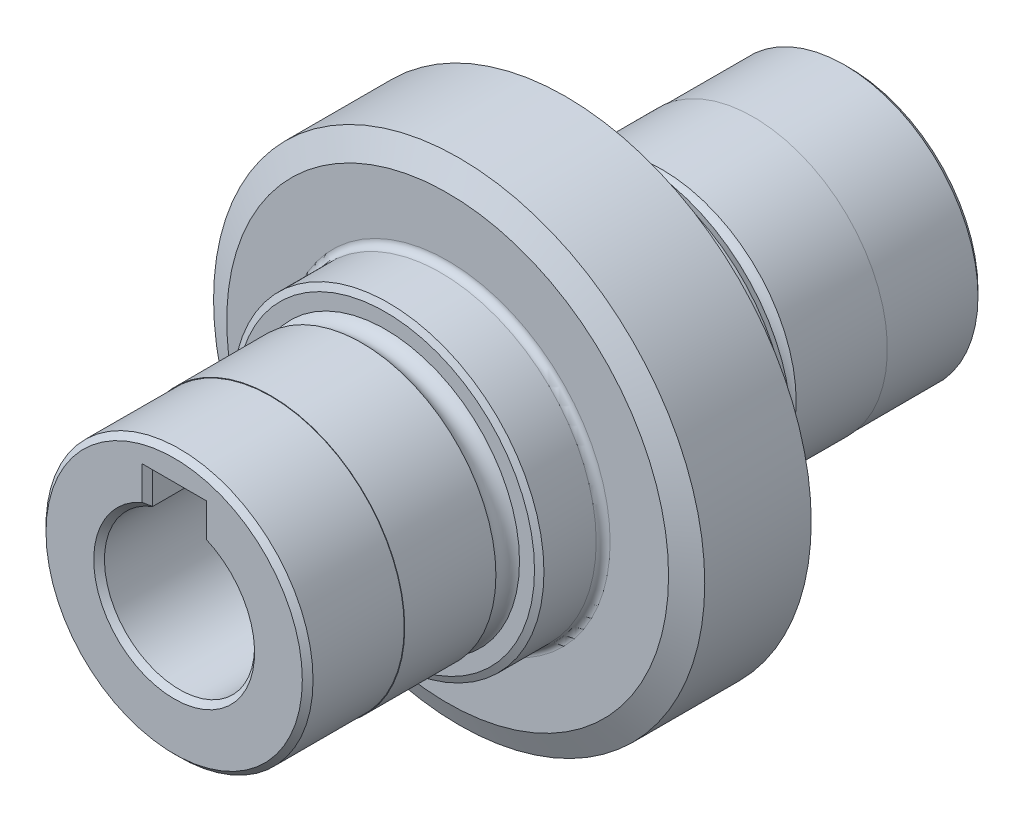
ISO-10303-21;
HEADER;
FILE_DESCRIPTION(('STEP AP214'),'2;1');
FILE_NAME('part.step','',(''),(''),'','','');
FILE_SCHEMA(('AUTOMOTIVE_DESIGN { 1 0 10303 214 1 1 1 1 }'));
ENDSEC;
DATA;
#1=APPLICATION_CONTEXT('core data for automotive mechanical design processes');
#2=APPLICATION_PROTOCOL_DEFINITION('international standard','automotive_design',2000,#1);
#3=PRODUCT_CONTEXT('',#1,'mechanical');
#4=PRODUCT('Part','Part','',(#3));
#5=PRODUCT_RELATED_PRODUCT_CATEGORY('part','',(#4));
#6=PRODUCT_DEFINITION_FORMATION('','',#4);
#7=PRODUCT_DEFINITION_CONTEXT('part definition',#1,'design');
#8=PRODUCT_DEFINITION('design','',#6,#7);
#9=PRODUCT_DEFINITION_SHAPE('','',#8);
#10=(LENGTH_UNIT() NAMED_UNIT(*) SI_UNIT(.MILLI.,.METRE.));
#11=(NAMED_UNIT(*) PLANE_ANGLE_UNIT() SI_UNIT($,.RADIAN.));
#12=(NAMED_UNIT(*) SI_UNIT($,.STERADIAN.) SOLID_ANGLE_UNIT());
#13=UNCERTAINTY_MEASURE_WITH_UNIT(LENGTH_MEASURE(1.E-05),#10,'distance_accuracy_value','');
#14=(GEOMETRIC_REPRESENTATION_CONTEXT(3) GLOBAL_UNCERTAINTY_ASSIGNED_CONTEXT((#13)) GLOBAL_UNIT_ASSIGNED_CONTEXT((#10,
#11,#12)) REPRESENTATION_CONTEXT('',''));
#15=CARTESIAN_POINT('',(0.,0.,0.));
#16=DIRECTION('',(0.,0.,1.));
#17=DIRECTION('',(1.,0.,0.));
#18=AXIS2_PLACEMENT_3D('',#15,#16,#17);
#19=CARTESIAN_POINT('',(0.,0.,31.5));
#20=DIRECTION('',(0.,0.,1.));
#21=DIRECTION('',(1.,0.,0.));
#22=AXIS2_PLACEMENT_3D('',#19,#20,#21);
#23=PLANE('',#22);
#24=CARTESIAN_POINT('',(0.,0.,31.5));
#25=DIRECTION('',(0.,0.,1.));
#26=DIRECTION('',(1.,0.,0.));
#27=AXIS2_PLACEMENT_3D('',#24,#25,#26);
#28=CIRCLE('',#27,11.95);
#29=CARTESIAN_POINT('',(11.95,0.,31.5));
#30=VERTEX_POINT('',#29);
#31=EDGE_CURVE('E130',#30,#30,#28,.T.);
#32=ORIENTED_EDGE('',*,*,#31,.T.);
#33=EDGE_LOOP('',(#32));
#34=FACE_BOUND('',#33,.T.);
#35=DIRECTION('',(0.,1.,0.));
#36=VECTOR('',#35,1.);
#37=CARTESIAN_POINT('',(-3.00000000000001,9.5,31.5));
#38=LINE('',#37,#36);
#39=CARTESIAN_POINT('',(-3.00000000000001,6.87386354243377,31.5));
#40=VERTEX_POINT('',#39);
#41=CARTESIAN_POINT('',(-3.00000000000001,10.,31.5));
#42=VERTEX_POINT('',#41);
#43=EDGE_CURVE('E129',#40,#42,#38,.T.);
#44=ORIENTED_EDGE('',*,*,#43,.T.);
#45=DIRECTION('',(1.,0.,0.));
#46=VECTOR('',#45,1.);
#47=CARTESIAN_POINT('',(2.5,10.,31.5));
#48=LINE('',#47,#46);
#49=CARTESIAN_POINT('',(3.00000000000002,10.,31.5));
#50=VERTEX_POINT('',#49);
#51=EDGE_CURVE('E109',#42,#50,#48,.T.);
#52=ORIENTED_EDGE('',*,*,#51,.T.);
#53=DIRECTION('',(0.,-1.,0.));
#54=VECTOR('',#53,1.);
#55=CARTESIAN_POINT('',(3.00000000000002,6.53834841531101,31.5));
#56=LINE('',#55,#54);
#57=CARTESIAN_POINT('',(3.00000000000002,6.87386354243377,31.5));
#58=VERTEX_POINT('',#57);
#59=EDGE_CURVE('E119',#50,#58,#56,.T.);
#60=ORIENTED_EDGE('',*,*,#59,.T.);
#61=CARTESIAN_POINT('',(0.,0.,31.5));
#62=DIRECTION('',(0.,0.,1.));
#63=DIRECTION('',(1.,0.,0.));
#64=AXIS2_PLACEMENT_3D('',#61,#62,#63);
#65=CIRCLE('',#64,7.50000000000001);
#66=EDGE_CURVE('E125',#58,#40,#65,.F.);
#67=ORIENTED_EDGE('',*,*,#66,.T.);
#68=EDGE_LOOP('',(#44,#52,#60,#67));
#69=FACE_BOUND('',#68,.T.);
#70=ADVANCED_FACE('F38',(#34,#69),#23,.T.);
#71=CARTESIAN_POINT('',(0.,0.,11.8));
#72=DIRECTION('',(0.,0.,1.));
#73=DIRECTION('',(1.,0.,0.));
#74=AXIS2_PLACEMENT_3D('',#71,#72,#73);
#75=CYLINDRICAL_SURFACE('',#74,12.5);
#76=CARTESIAN_POINT('',(0.,0.,14.));
#77=DIRECTION('',(0.,0.,1.));
#78=DIRECTION('',(1.,0.,0.));
#79=AXIS2_PLACEMENT_3D('',#76,#77,#78);
#80=CIRCLE('',#79,12.5);
#81=CARTESIAN_POINT('',(12.5,0.,14.));
#82=VERTEX_POINT('',#81);
#83=EDGE_CURVE('E650',#82,#82,#80,.T.);
#84=ORIENTED_EDGE('',*,*,#83,.T.);
#85=EDGE_LOOP('',(#84));
#86=FACE_BOUND('',#85,.T.);
#87=CARTESIAN_POINT('',(0.,0.,22.5));
#88=DIRECTION('',(0.,0.,-1.));
#89=DIRECTION('',(-1.,0.,0.));
#90=AXIS2_PLACEMENT_3D('',#87,#88,#89);
#91=CIRCLE('',#90,12.5);
#92=CARTESIAN_POINT('',(-12.5,0.,22.5));
#93=VERTEX_POINT('',#92);
#94=EDGE_CURVE('E594',#93,#93,#91,.T.);
#95=ORIENTED_EDGE('',*,*,#94,.T.);
#96=EDGE_LOOP('',(#95));
#97=FACE_BOUND('',#96,.T.);
#98=ADVANCED_FACE('F272',(#86,#97),#75,.T.);
#99=CARTESIAN_POINT('',(0.,0.,6.));
#100=DIRECTION('',(0.,0.,1.));
#101=DIRECTION('',(1.,0.,0.));
#102=AXIS2_PLACEMENT_3D('',#99,#100,#101);
#103=CYLINDRICAL_SURFACE('',#102,14.5);
#104=CARTESIAN_POINT('',(0.,0.,6.65));
#105=DIRECTION('',(0.,0.,1.));
#106=DIRECTION('',(1.,0.,0.));
#107=AXIS2_PLACEMENT_3D('',#104,#105,#106);
#108=CIRCLE('',#107,14.5);
#109=CARTESIAN_POINT('',(14.5,0.,6.65));
#110=VERTEX_POINT('',#109);
#111=EDGE_CURVE('E702',#110,#110,#108,.T.);
#112=ORIENTED_EDGE('',*,*,#111,.T.);
#113=EDGE_LOOP('',(#112));
#114=FACE_BOUND('',#113,.T.);
#115=CARTESIAN_POINT('',(0.,0.,11.520215405107));
#116=DIRECTION('',(0.,0.,1.));
#117=DIRECTION('',(1.,0.,0.));
#118=AXIS2_PLACEMENT_3D('',#115,#116,#117);
#119=CIRCLE('',#118,14.5);
#120=CARTESIAN_POINT('',(14.5,0.,11.520215405107));
#121=VERTEX_POINT('',#120);
#122=EDGE_CURVE('E625',#121,#121,#119,.F.);
#123=ORIENTED_EDGE('',*,*,#122,.T.);
#124=EDGE_LOOP('',(#123));
#125=FACE_BOUND('',#124,.T.);
#126=ADVANCED_FACE('F278',(#114,#125),#103,.T.);
#127=CARTESIAN_POINT('',(0.,0.,31.5));
#128=DIRECTION('',(0.,0.,-1.));
#129=DIRECTION('',(-1.,0.,0.));
#130=AXIS2_PLACEMENT_3D('',#127,#128,#129);
#131=CYLINDRICAL_SURFACE('',#130,22.9);
#132=CARTESIAN_POINT('',(0.,0.,4.9274923862435));
#133=DIRECTION('',(0.,0.,1.));
#134=DIRECTION('',(1.,0.,0.));
#135=AXIS2_PLACEMENT_3D('',#132,#133,#134);
#136=CIRCLE('',#135,22.9);
#137=CARTESIAN_POINT('',(22.9,0.,4.9274923862435));
#138=VERTEX_POINT('',#137);
#139=EDGE_CURVE('E47',#138,#138,#136,.F.);
#140=ORIENTED_EDGE('',*,*,#139,.T.);
#141=EDGE_LOOP('',(#140));
#142=FACE_BOUND('',#141,.T.);
#143=CARTESIAN_POINT('',(0.,0.,-5.00000000000001));
#144=DIRECTION('',(0.,0.,-1.));
#145=DIRECTION('',(-1.,0.,0.));
#146=AXIS2_PLACEMENT_3D('',#143,#144,#145);
#147=CIRCLE('',#146,22.9);
#148=CARTESIAN_POINT('',(-22.9,0.,-5.00000000000001));
#149=VERTEX_POINT('',#148);
#150=EDGE_CURVE('E712',#149,#149,#147,.F.);
#151=ORIENTED_EDGE('',*,*,#150,.T.);
#152=EDGE_LOOP('',(#151));
#153=FACE_BOUND('',#152,.T.);
#154=ADVANCED_FACE('F289',(#142,#153),#131,.T.);
#155=CARTESIAN_POINT('',(0.,0.,-31.5));
#156=DIRECTION('',(0.,0.,1.));
#157=DIRECTION('',(1.,0.,0.));
#158=AXIS2_PLACEMENT_3D('',#155,#156,#157);
#159=PLANE('',#158);
#160=CARTESIAN_POINT('',(0.,0.,-31.5));
#161=DIRECTION('',(0.,0.,1.));
#162=DIRECTION('',(1.,0.,0.));
#163=AXIS2_PLACEMENT_3D('',#160,#161,#162);
#164=CIRCLE('',#163,11.95);
#165=CARTESIAN_POINT('',(11.95,0.,-31.5));
#166=VERTEX_POINT('',#165);
#167=EDGE_CURVE('E159',#166,#166,#164,.F.);
#168=ORIENTED_EDGE('',*,*,#167,.T.);
#169=EDGE_LOOP('',(#168));
#170=FACE_BOUND('',#169,.T.);
#171=DIRECTION('',(-1.,0.,0.));
#172=VECTOR('',#171,1.);
#173=CARTESIAN_POINT('',(0.,9.99999999999998,-31.5));
#174=LINE('',#173,#172);
#175=CARTESIAN_POINT('',(2.99999999999998,9.99999999999998,-31.5));
#176=VERTEX_POINT('',#175);
#177=CARTESIAN_POINT('',(-2.99999999999998,9.99999999999998,-31.5));
#178=VERTEX_POINT('',#177);
#179=EDGE_CURVE('E54',#176,#178,#174,.T.);
#180=ORIENTED_EDGE('',*,*,#179,.T.);
#181=DIRECTION('',(0.,-1.,0.));
#182=VECTOR('',#181,1.);
#183=CARTESIAN_POINT('',(-2.99999999999998,0.,-31.5));
#184=LINE('',#183,#182);
#185=CARTESIAN_POINT('',(-2.99999999999997,6.87386354243375,-31.5));
#186=VERTEX_POINT('',#185);
#187=EDGE_CURVE('E157',#178,#186,#184,.T.);
#188=ORIENTED_EDGE('',*,*,#187,.T.);
#189=CARTESIAN_POINT('',(0.,0.,-31.5));
#190=DIRECTION('',(0.,0.,1.));
#191=DIRECTION('',(1.,0.,0.));
#192=AXIS2_PLACEMENT_3D('',#189,#190,#191);
#193=CIRCLE('',#192,7.49999999999998);
#194=CARTESIAN_POINT('',(2.99999999999998,6.87386354243375,-31.5));
#195=VERTEX_POINT('',#194);
#196=EDGE_CURVE('E153',#186,#195,#193,.T.);
#197=ORIENTED_EDGE('',*,*,#196,.T.);
#198=DIRECTION('',(0.,1.,0.));
#199=VECTOR('',#198,1.);
#200=CARTESIAN_POINT('',(2.99999999999999,0.,-31.5));
#201=LINE('',#200,#199);
#202=EDGE_CURVE('E59',#195,#176,#201,.T.);
#203=ORIENTED_EDGE('',*,*,#202,.T.);
#204=EDGE_LOOP('',(#180,#188,#197,#203));
#205=FACE_BOUND('',#204,.T.);
#206=ADVANCED_FACE('F285',(#170,#205),#159,.F.);
#207=CARTESIAN_POINT('',(0.,0.,-11.8));
#208=DIRECTION('',(0.,0.,-1.));
#209=DIRECTION('',(-1.,0.,0.));
#210=AXIS2_PLACEMENT_3D('',#207,#208,#209);
#211=CYLINDRICAL_SURFACE('',#210,12.5);
#212=CARTESIAN_POINT('',(0.,0.,-14.));
#213=DIRECTION('',(0.,0.,1.));
#214=DIRECTION('',(1.,0.,0.));
#215=AXIS2_PLACEMENT_3D('',#212,#213,#214);
#216=CIRCLE('',#215,12.5);
#217=CARTESIAN_POINT('',(12.5,0.,-14.));
#218=VERTEX_POINT('',#217);
#219=EDGE_CURVE('E593',#218,#218,#216,.T.);
#220=ORIENTED_EDGE('',*,*,#219,.F.);
#221=EDGE_LOOP('',(#220));
#222=FACE_BOUND('',#221,.T.);
#223=CARTESIAN_POINT('',(0.,0.,-22.5));
#224=DIRECTION('',(0.,0.,-1.));
#225=DIRECTION('',(-1.,0.,0.));
#226=AXIS2_PLACEMENT_3D('',#223,#224,#225);
#227=CIRCLE('',#226,12.5);
#228=CARTESIAN_POINT('',(-12.5,0.,-22.5));
#229=VERTEX_POINT('',#228);
#230=EDGE_CURVE('E606',#229,#229,#227,.T.);
#231=ORIENTED_EDGE('',*,*,#230,.F.);
#232=EDGE_LOOP('',(#231));
#233=FACE_BOUND('',#232,.T.);
#234=ADVANCED_FACE('F288',(#222,#233),#211,.T.);
#235=CARTESIAN_POINT('',(0.,0.,-6.));
#236=DIRECTION('',(0.,0.,-1.));
#237=DIRECTION('',(-1.,0.,0.));
#238=AXIS2_PLACEMENT_3D('',#235,#236,#237);
#239=CYLINDRICAL_SURFACE('',#238,14.5);
#240=CARTESIAN_POINT('',(0.,0.,-6.65));
#241=DIRECTION('',(0.,0.,-1.));
#242=DIRECTION('',(-1.,0.,0.));
#243=AXIS2_PLACEMENT_3D('',#240,#241,#242);
#244=CIRCLE('',#243,14.5);
#245=CARTESIAN_POINT('',(-14.5,0.,-6.65));
#246=VERTEX_POINT('',#245);
#247=EDGE_CURVE('E699',#246,#246,#244,.T.);
#248=ORIENTED_EDGE('',*,*,#247,.T.);
#249=EDGE_LOOP('',(#248));
#250=FACE_BOUND('',#249,.T.);
#251=CARTESIAN_POINT('',(0.,0.,-11.2));
#252=DIRECTION('',(0.,0.,-1.));
#253=DIRECTION('',(-1.,0.,0.));
#254=AXIS2_PLACEMENT_3D('',#251,#252,#253);
#255=CIRCLE('',#254,14.5);
#256=CARTESIAN_POINT('',(-14.5,0.,-11.2));
#257=VERTEX_POINT('',#256);
#258=EDGE_CURVE('E622',#257,#257,#255,.F.);
#259=ORIENTED_EDGE('',*,*,#258,.T.);
#260=EDGE_LOOP('',(#259));
#261=FACE_BOUND('',#260,.T.);
#262=ADVANCED_FACE('F507',(#250,#261),#239,.T.);
#263=CARTESIAN_POINT('',(0.,0.,-31.5));
#264=DIRECTION('',(0.,0.,1.));
#265=DIRECTION('',(1.,0.,0.));
#266=AXIS2_PLACEMENT_3D('',#263,#264,#265);
#267=CYLINDRICAL_SURFACE('',#266,7.);
#268=DIRECTION('',(0.,0.,1.));
#269=VECTOR('',#268,1.);
#270=CARTESIAN_POINT('',(-2.5,6.53834841531101,-31.5));
#271=LINE('',#270,#269);
#272=CARTESIAN_POINT('',(-2.5,6.53834841531101,-31.));
#273=VERTEX_POINT('',#272);
#274=CARTESIAN_POINT('',(-2.5,6.53834841531101,31.));
#275=VERTEX_POINT('',#274);
#276=EDGE_CURVE('E613',#273,#275,#271,.T.);
#277=ORIENTED_EDGE('',*,*,#276,.T.);
#278=CARTESIAN_POINT('',(0.,0.,31.));
#279=DIRECTION('',(0.,0.,1.));
#280=DIRECTION('',(1.,0.,0.));
#281=AXIS2_PLACEMENT_3D('',#278,#279,#280);
#282=CIRCLE('',#281,7.);
#283=CARTESIAN_POINT('',(2.5,6.53834841531101,31.));
#284=VERTEX_POINT('',#283);
#285=EDGE_CURVE('E147',#275,#284,#282,.T.);
#286=ORIENTED_EDGE('',*,*,#285,.T.);
#287=DIRECTION('',(0.,0.,1.));
#288=VECTOR('',#287,1.);
#289=CARTESIAN_POINT('',(2.5,6.53834841531101,-31.5));
#290=LINE('',#289,#288);
#291=CARTESIAN_POINT('',(2.5,6.53834841531101,-31.));
#292=VERTEX_POINT('',#291);
#293=EDGE_CURVE('E618',#284,#292,#290,.F.);
#294=ORIENTED_EDGE('',*,*,#293,.T.);
#295=CARTESIAN_POINT('',(0.,0.,-31.));
#296=DIRECTION('',(0.,0.,1.));
#297=DIRECTION('',(1.,0.,0.));
#298=AXIS2_PLACEMENT_3D('',#295,#296,#297);
#299=CIRCLE('',#298,7.);
#300=EDGE_CURVE('E145',#292,#273,#299,.F.);
#301=ORIENTED_EDGE('',*,*,#300,.T.);
#302=EDGE_LOOP('',(#277,#286,#294,#301));
#303=FACE_BOUND('',#302,.T.);
#304=ADVANCED_FACE('F283',(#303),#267,.F.);
#305=CARTESIAN_POINT('',(2.5,9.5,-31.5));
#306=DIRECTION('',(1.,0.,0.));
#307=DIRECTION('',(0.,1.,0.));
#308=AXIS2_PLACEMENT_3D('',#305,#306,#307);
#309=PLANE('',#308);
#310=ORIENTED_EDGE('',*,*,#293,.F.);
#311=DIRECTION('',(0.,1.,0.));
#312=VECTOR('',#311,1.);
#313=CARTESIAN_POINT('',(2.5,9.5,31.));
#314=LINE('',#313,#312);
#315=CARTESIAN_POINT('',(2.5,9.5,31.));
#316=VERTEX_POINT('',#315);
#317=EDGE_CURVE('E151',#284,#316,#314,.T.);
#318=ORIENTED_EDGE('',*,*,#317,.T.);
#319=DIRECTION('',(0.,0.,1.));
#320=VECTOR('',#319,1.);
#321=CARTESIAN_POINT('',(2.5,9.5,-31.5));
#322=LINE('',#321,#320);
#323=CARTESIAN_POINT('',(2.5,9.5,-31.));
#324=VERTEX_POINT('',#323);
#325=EDGE_CURVE('E609',#324,#316,#322,.T.);
#326=ORIENTED_EDGE('',*,*,#325,.F.);
#327=DIRECTION('',(0.,-1.,0.));
#328=VECTOR('',#327,1.);
#329=CARTESIAN_POINT('',(2.5,9.5,-31.));
#330=LINE('',#329,#328);
#331=EDGE_CURVE('E149',#324,#292,#330,.T.);
#332=ORIENTED_EDGE('',*,*,#331,.T.);
#333=EDGE_LOOP('',(#310,#318,#326,#332));
#334=FACE_BOUND('',#333,.T.);
#335=ADVANCED_FACE('F523',(#334),#309,.F.);
#336=CARTESIAN_POINT('',(-2.5,9.5,-31.5));
#337=DIRECTION('',(-1.,0.,0.));
#338=DIRECTION('',(0.,0.,1.));
#339=AXIS2_PLACEMENT_3D('',#336,#337,#338);
#340=PLANE('',#339);
#341=DIRECTION('',(0.,0.,1.));
#342=VECTOR('',#341,1.);
#343=CARTESIAN_POINT('',(-2.5,9.5,-31.5));
#344=LINE('',#343,#342);
#345=CARTESIAN_POINT('',(-2.5,9.5,-31.));
#346=VERTEX_POINT('',#345);
#347=CARTESIAN_POINT('',(-2.5,9.5,31.));
#348=VERTEX_POINT('',#347);
#349=EDGE_CURVE('E610',#346,#348,#344,.T.);
#350=ORIENTED_EDGE('',*,*,#349,.T.);
#351=DIRECTION('',(0.,-1.,0.));
#352=VECTOR('',#351,1.);
#353=CARTESIAN_POINT('',(-2.5,6.53834841531101,31.));
#354=LINE('',#353,#352);
#355=EDGE_CURVE('E143',#348,#275,#354,.T.);
#356=ORIENTED_EDGE('',*,*,#355,.T.);
#357=ORIENTED_EDGE('',*,*,#276,.F.);
#358=DIRECTION('',(0.,1.,0.));
#359=VECTOR('',#358,1.);
#360=CARTESIAN_POINT('',(-2.5,9.5,-31.));
#361=LINE('',#360,#359);
#362=EDGE_CURVE('E140',#273,#346,#361,.T.);
#363=ORIENTED_EDGE('',*,*,#362,.T.);
#364=EDGE_LOOP('',(#350,#356,#357,#363));
#365=FACE_BOUND('',#364,.T.);
#366=ADVANCED_FACE('F530',(#365),#340,.F.);
#367=CARTESIAN_POINT('',(-2.5,9.5,-31.5));
#368=DIRECTION('',(0.,1.,0.));
#369=DIRECTION('',(-1.,0.,0.));
#370=AXIS2_PLACEMENT_3D('',#367,#368,#369);
#371=PLANE('',#370);
#372=ORIENTED_EDGE('',*,*,#325,.T.);
#373=DIRECTION('',(-1.,0.,0.));
#374=VECTOR('',#373,1.);
#375=CARTESIAN_POINT('',(-2.5,9.5,31.));
#376=LINE('',#375,#374);
#377=EDGE_CURVE('E112',#316,#348,#376,.T.);
#378=ORIENTED_EDGE('',*,*,#377,.T.);
#379=ORIENTED_EDGE('',*,*,#349,.F.);
#380=DIRECTION('',(1.,0.,0.));
#381=VECTOR('',#380,1.);
#382=CARTESIAN_POINT('',(-2.5,9.5,-31.));
#383=LINE('',#382,#381);
#384=EDGE_CURVE('E133',#346,#324,#383,.T.);
#385=ORIENTED_EDGE('',*,*,#384,.T.);
#386=EDGE_LOOP('',(#372,#378,#379,#385));
#387=FACE_BOUND('',#386,.T.);
#388=ADVANCED_FACE('F367',(#387),#371,.F.);
#389=CARTESIAN_POINT('',(0.,0.,-6.));
#390=DIRECTION('',(0.,0.,-1.));
#391=DIRECTION('',(-1.,0.,0.));
#392=AXIS2_PLACEMENT_3D('',#389,#390,#391);
#393=PLANE('',#392);
#394=CARTESIAN_POINT('',(0.,0.,-6.));
#395=DIRECTION('',(0.,0.,-1.));
#396=DIRECTION('',(-1.,0.,0.));
#397=AXIS2_PLACEMENT_3D('',#394,#395,#396);
#398=CIRCLE('',#397,20.6001574527638);
#399=CARTESIAN_POINT('',(-20.6001574527638,0.,-6.));
#400=VERTEX_POINT('',#399);
#401=EDGE_CURVE('E705',#400,#400,#398,.T.);
#402=ORIENTED_EDGE('',*,*,#401,.T.);
#403=EDGE_LOOP('',(#402));
#404=FACE_BOUND('',#403,.T.);
#405=CARTESIAN_POINT('',(0.,0.,-6.));
#406=DIRECTION('',(0.,0.,-1.));
#407=DIRECTION('',(-1.,0.,0.));
#408=AXIS2_PLACEMENT_3D('',#405,#406,#407);
#409=CIRCLE('',#408,15.15);
#410=CARTESIAN_POINT('',(-15.15,0.,-6.));
#411=VERTEX_POINT('',#410);
#412=EDGE_CURVE('E701',#411,#411,#409,.F.);
#413=ORIENTED_EDGE('',*,*,#412,.T.);
#414=EDGE_LOOP('',(#413));
#415=FACE_BOUND('',#414,.T.);
#416=ADVANCED_FACE('F362',(#404,#415),#393,.T.);
#417=CARTESIAN_POINT('',(0.,0.,-11.8));
#418=DIRECTION('',(0.,0.,-1.));
#419=DIRECTION('',(-1.,0.,0.));
#420=AXIS2_PLACEMENT_3D('',#417,#418,#419);
#421=PLANE('',#420);
#422=CARTESIAN_POINT('',(0.,0.,-11.8));
#423=DIRECTION('',(0.,0.,-1.));
#424=DIRECTION('',(-1.,0.,0.));
#425=AXIS2_PLACEMENT_3D('',#422,#423,#424);
#426=CIRCLE('',#425,14.220215405107);
#427=CARTESIAN_POINT('',(-14.220215405107,0.,-11.8));
#428=VERTEX_POINT('',#427);
#429=EDGE_CURVE('E590',#428,#428,#426,.T.);
#430=ORIENTED_EDGE('',*,*,#429,.T.);
#431=EDGE_LOOP('',(#430));
#432=FACE_BOUND('',#431,.T.);
#433=CARTESIAN_POINT('',(0.,0.,-11.8));
#434=DIRECTION('',(0.,0.,1.));
#435=DIRECTION('',(1.,0.,0.));
#436=AXIS2_PLACEMENT_3D('',#433,#434,#435);
#437=CIRCLE('',#436,12.5);
#438=CARTESIAN_POINT('',(12.5,0.,-11.8));
#439=VERTEX_POINT('',#438);
#440=EDGE_CURVE('E592',#439,#439,#437,.T.);
#441=ORIENTED_EDGE('',*,*,#440,.T.);
#442=EDGE_LOOP('',(#441));
#443=FACE_BOUND('',#442,.T.);
#444=ADVANCED_FACE('F366',(#432,#443),#421,.T.);
#445=CARTESIAN_POINT('',(0.,0.,-22.5));
#446=DIRECTION('',(0.,0.,-1.));
#447=DIRECTION('',(-1.,0.,0.));
#448=AXIS2_PLACEMENT_3D('',#445,#446,#447);
#449=PLANE('',#448);
#450=CARTESIAN_POINT('',(0.,0.,-22.5));
#451=DIRECTION('',(0.,0.,-1.));
#452=DIRECTION('',(-1.,0.,0.));
#453=AXIS2_PLACEMENT_3D('',#450,#451,#452);
#454=CIRCLE('',#453,12.45);
#455=CARTESIAN_POINT('',(-12.45,0.,-22.5));
#456=VERTEX_POINT('',#455);
#457=EDGE_CURVE('E597',#456,#456,#454,.T.);
#458=ORIENTED_EDGE('',*,*,#457,.F.);
#459=EDGE_LOOP('',(#458));
#460=FACE_BOUND('',#459,.T.);
#461=ORIENTED_EDGE('',*,*,#230,.T.);
#462=EDGE_LOOP('',(#461));
#463=FACE_BOUND('',#462,.T.);
#464=ADVANCED_FACE('F550',(#460,#463),#449,.T.);
#465=CARTESIAN_POINT('',(0.,0.,-22.5));
#466=DIRECTION('',(0.,0.,-1.));
#467=DIRECTION('',(-1.,0.,0.));
#468=AXIS2_PLACEMENT_3D('',#465,#466,#467);
#469=CYLINDRICAL_SURFACE('',#468,12.45);
#470=CARTESIAN_POINT('',(0.,0.,-31.));
#471=DIRECTION('',(0.,0.,1.));
#472=DIRECTION('',(1.,0.,0.));
#473=AXIS2_PLACEMENT_3D('',#470,#471,#472);
#474=CIRCLE('',#473,12.45);
#475=CARTESIAN_POINT('',(12.45,0.,-31.));
#476=VERTEX_POINT('',#475);
#477=EDGE_CURVE('E162',#476,#476,#474,.T.);
#478=ORIENTED_EDGE('',*,*,#477,.T.);
#479=EDGE_LOOP('',(#478));
#480=FACE_BOUND('',#479,.T.);
#481=ORIENTED_EDGE('',*,*,#457,.T.);
#482=EDGE_LOOP('',(#481));
#483=FACE_BOUND('',#482,.T.);
#484=ADVANCED_FACE('F302',(#480,#483),#469,.T.);
#485=CARTESIAN_POINT('',(0.,0.,-11.8));
#486=DIRECTION('',(0.,0.,1.));
#487=DIRECTION('',(1.,0.,0.));
#488=AXIS2_PLACEMENT_3D('',#485,#486,#487);
#489=CONICAL_SURFACE('',#488,14.220215405107,0.436332312998589);
#490=ORIENTED_EDGE('',*,*,#258,.F.);
#491=EDGE_LOOP('',(#490));
#492=FACE_BOUND('',#491,.T.);
#493=ORIENTED_EDGE('',*,*,#429,.F.);
#494=EDGE_LOOP('',(#493));
#495=FACE_BOUND('',#494,.T.);
#496=ADVANCED_FACE('F295',(#492,#495),#489,.T.);
#497=CARTESIAN_POINT('',(0.,0.,-12.9));
#498=DIRECTION('',(0.,0.,1.));
#499=DIRECTION('',(1.,0.,0.));
#500=AXIS2_PLACEMENT_3D('',#497,#498,#499);
#501=TOROIDAL_SURFACE('',#500,13.1928203230276,1.3);
#502=ORIENTED_EDGE('',*,*,#440,.F.);
#503=EDGE_LOOP('',(#502));
#504=FACE_BOUND('',#503,.T.);
#505=ORIENTED_EDGE('',*,*,#219,.T.);
#506=EDGE_LOOP('',(#505));
#507=FACE_BOUND('',#506,.T.);
#508=ADVANCED_FACE('F301',(#504,#507),#501,.F.);
#509=CARTESIAN_POINT('',(0.,0.,6.));
#510=DIRECTION('',(0.,0.,1.));
#511=DIRECTION('',(-1.,0.,0.));
#512=AXIS2_PLACEMENT_3D('',#509,#510,#511);
#513=PLANE('',#512);
#514=CARTESIAN_POINT('',(0.,0.,6.));
#515=DIRECTION('',(0.,0.,1.));
#516=DIRECTION('',(1.,0.,0.));
#517=AXIS2_PLACEMENT_3D('',#514,#515,#516);
#518=CIRCLE('',#517,20.6);
#519=CARTESIAN_POINT('',(20.6,0.,6.));
#520=VERTEX_POINT('',#519);
#521=EDGE_CURVE('E11',#520,#520,#518,.T.);
#522=ORIENTED_EDGE('',*,*,#521,.T.);
#523=EDGE_LOOP('',(#522));
#524=FACE_BOUND('',#523,.T.);
#525=CARTESIAN_POINT('',(0.,0.,6.));
#526=DIRECTION('',(0.,0.,1.));
#527=DIRECTION('',(1.,0.,0.));
#528=AXIS2_PLACEMENT_3D('',#525,#526,#527);
#529=CIRCLE('',#528,15.15);
#530=CARTESIAN_POINT('',(15.15,0.,6.));
#531=VERTEX_POINT('',#530);
#532=EDGE_CURVE('E165',#531,#531,#529,.F.);
#533=ORIENTED_EDGE('',*,*,#532,.T.);
#534=EDGE_LOOP('',(#533));
#535=FACE_BOUND('',#534,.T.);
#536=ADVANCED_FACE('F391',(#524,#535),#513,.T.);
#537=CARTESIAN_POINT('',(0.,0.,11.8));
#538=DIRECTION('',(0.,0.,1.));
#539=DIRECTION('',(-1.,0.,0.));
#540=AXIS2_PLACEMENT_3D('',#537,#538,#539);
#541=PLANE('',#540);
#542=CARTESIAN_POINT('',(0.,0.,11.8));
#543=DIRECTION('',(0.,0.,1.));
#544=DIRECTION('',(1.,0.,0.));
#545=AXIS2_PLACEMENT_3D('',#542,#543,#544);
#546=CIRCLE('',#545,13.9);
#547=CARTESIAN_POINT('',(13.9,0.,11.8));
#548=VERTEX_POINT('',#547);
#549=EDGE_CURVE('E628',#548,#548,#546,.T.);
#550=ORIENTED_EDGE('',*,*,#549,.T.);
#551=EDGE_LOOP('',(#550));
#552=FACE_BOUND('',#551,.T.);
#553=CARTESIAN_POINT('',(0.,0.,11.8));
#554=DIRECTION('',(0.,0.,1.));
#555=DIRECTION('',(1.,0.,0.));
#556=AXIS2_PLACEMENT_3D('',#553,#554,#555);
#557=CIRCLE('',#556,12.5);
#558=CARTESIAN_POINT('',(12.5,0.,11.8));
#559=VERTEX_POINT('',#558);
#560=EDGE_CURVE('E648',#559,#559,#557,.T.);
#561=ORIENTED_EDGE('',*,*,#560,.F.);
#562=EDGE_LOOP('',(#561));
#563=FACE_BOUND('',#562,.T.);
#564=ADVANCED_FACE('F395',(#552,#563),#541,.T.);
#565=CARTESIAN_POINT('',(0.,0.,22.5));
#566=DIRECTION('',(0.,0.,1.));
#567=DIRECTION('',(-1.,0.,0.));
#568=AXIS2_PLACEMENT_3D('',#565,#566,#567);
#569=PLANE('',#568);
#570=ORIENTED_EDGE('',*,*,#94,.F.);
#571=EDGE_LOOP('',(#570));
#572=FACE_BOUND('',#571,.T.);
#573=CARTESIAN_POINT('',(0.,0.,22.5));
#574=DIRECTION('',(0.,0.,-1.));
#575=DIRECTION('',(-1.,0.,0.));
#576=AXIS2_PLACEMENT_3D('',#573,#574,#575);
#577=CIRCLE('',#576,12.45);
#578=CARTESIAN_POINT('',(-12.45,0.,22.5));
#579=VERTEX_POINT('',#578);
#580=EDGE_CURVE('E600',#579,#579,#577,.T.);
#581=ORIENTED_EDGE('',*,*,#580,.T.);
#582=EDGE_LOOP('',(#581));
#583=FACE_BOUND('',#582,.T.);
#584=ADVANCED_FACE('F413',(#572,#583),#569,.T.);
#585=CARTESIAN_POINT('',(0.,0.,22.5));
#586=DIRECTION('',(0.,0.,1.));
#587=DIRECTION('',(1.,0.,0.));
#588=AXIS2_PLACEMENT_3D('',#585,#586,#587);
#589=CYLINDRICAL_SURFACE('',#588,12.45);
#590=CARTESIAN_POINT('',(0.,0.,31.));
#591=DIRECTION('',(0.,0.,1.));
#592=DIRECTION('',(1.,0.,0.));
#593=AXIS2_PLACEMENT_3D('',#590,#591,#592);
#594=CIRCLE('',#593,12.45);
#595=CARTESIAN_POINT('',(12.45,0.,31.));
#596=VERTEX_POINT('',#595);
#597=EDGE_CURVE('E126',#596,#596,#594,.F.);
#598=ORIENTED_EDGE('',*,*,#597,.T.);
#599=EDGE_LOOP('',(#598));
#600=FACE_BOUND('',#599,.T.);
#601=ORIENTED_EDGE('',*,*,#580,.F.);
#602=EDGE_LOOP('',(#601));
#603=FACE_BOUND('',#602,.T.);
#604=ADVANCED_FACE('F310',(#600,#603),#589,.T.);
#605=CARTESIAN_POINT('',(0.,0.,11.520215405107));
#606=DIRECTION('',(0.,0.,-1.));
#607=DIRECTION('',(-1.,0.,0.));
#608=AXIS2_PLACEMENT_3D('',#605,#606,#607);
#609=CONICAL_SURFACE('',#608,14.5,1.13446401379631);
#610=ORIENTED_EDGE('',*,*,#549,.F.);
#611=EDGE_LOOP('',(#610));
#612=FACE_BOUND('',#611,.T.);
#613=ORIENTED_EDGE('',*,*,#122,.F.);
#614=EDGE_LOOP('',(#613));
#615=FACE_BOUND('',#614,.T.);
#616=ADVANCED_FACE('F304',(#612,#615),#609,.T.);
#617=CARTESIAN_POINT('',(0.,0.,12.9));
#618=DIRECTION('',(0.,0.,-1.));
#619=DIRECTION('',(1.,0.,0.));
#620=AXIS2_PLACEMENT_3D('',#617,#618,#619);
#621=TOROIDAL_SURFACE('',#620,13.1928203230276,1.3);
#622=ORIENTED_EDGE('',*,*,#560,.T.);
#623=EDGE_LOOP('',(#622));
#624=FACE_BOUND('',#623,.T.);
#625=ORIENTED_EDGE('',*,*,#83,.F.);
#626=EDGE_LOOP('',(#625));
#627=FACE_BOUND('',#626,.T.);
#628=ADVANCED_FACE('F309',(#624,#627),#621,.F.);
#629=CARTESIAN_POINT('',(0.,0.,31.));
#630=DIRECTION('',(0.,0.,-1.));
#631=DIRECTION('',(-1.,0.,0.));
#632=AXIS2_PLACEMENT_3D('',#629,#630,#631);
#633=CONICAL_SURFACE('',#632,12.45,0.785398163397452);
#634=ORIENTED_EDGE('',*,*,#31,.F.);
#635=EDGE_LOOP('',(#634));
#636=FACE_BOUND('',#635,.T.);
#637=ORIENTED_EDGE('',*,*,#597,.F.);
#638=EDGE_LOOP('',(#637));
#639=FACE_BOUND('',#638,.T.);
#640=ADVANCED_FACE('F312',(#636,#639),#633,.T.);
#641=CARTESIAN_POINT('',(0.,0.,31.));
#642=DIRECTION('',(0.,0.,1.));
#643=DIRECTION('',(1.,0.,0.));
#644=AXIS2_PLACEMENT_3D('',#641,#642,#643);
#645=CONICAL_SURFACE('',#644,7.,0.785398163397448);
#646=CARTESIAN_POINT('',(-2.5,6.53834841531101,31.));
#647=CARTESIAN_POINT('',(-2.58295035229862,6.59540932116829,31.0829503522986));
#648=CARTESIAN_POINT('',(-2.66609222898918,6.65189939018873,31.1660922289892));
#649=CARTESIAN_POINT('',(-2.83275889627583,6.7637377640485,31.3327588962758));
#650=CARTESIAN_POINT('',(-2.91628368625193,6.81908607073566,31.4162836862519));
#651=CARTESIAN_POINT('',(-2.99999999999999,6.87386354243384,31.5));
#652=B_SPLINE_CURVE_WITH_KNOTS('',3,(#646,#647,#648,#649,#650,#651),.UNSPECIFIED.,.F.,.F.,(4,2,
4),(0.,0.391339291350515,0.782677949303148),.UNSPECIFIED.);
#653=EDGE_CURVE('E115',#40,#275,#652,.F.);
#654=ORIENTED_EDGE('',*,*,#653,.F.);
#655=ORIENTED_EDGE('',*,*,#66,.F.);
#656=CARTESIAN_POINT('',(2.5,6.53834841531101,31.));
#657=CARTESIAN_POINT('',(2.58295035229863,6.59540932116828,31.0829503522986));
#658=CARTESIAN_POINT('',(2.66609222898919,6.65189939018873,31.1660922289892));
#659=CARTESIAN_POINT('',(2.83275889627583,6.76373776404849,31.3327588962758));
#660=CARTESIAN_POINT('',(2.91628368625193,6.81908607073566,31.4162836862519));
#661=CARTESIAN_POINT('',(2.99999999999999,6.87386354243383,31.5));
#662=B_SPLINE_CURVE_WITH_KNOTS('',3,(#656,#657,#658,#659,#660,#661),.UNSPECIFIED.,.F.,.F.,(4,2,
4),(0.,0.39133929135051,0.782677949303139),.UNSPECIFIED.);
#663=EDGE_CURVE('E122',#284,#58,#662,.T.);
#664=ORIENTED_EDGE('',*,*,#663,.F.);
#665=ORIENTED_EDGE('',*,*,#285,.F.);
#666=EDGE_LOOP('',(#654,#655,#664,#665));
#667=FACE_BOUND('',#666,.T.);
#668=ADVANCED_FACE('F183',(#667),#645,.F.);
#669=CARTESIAN_POINT('',(2.5,9.5,31.));
#670=DIRECTION('',(-0.707106781186548,0.,0.707106781186548));
#671=DIRECTION('',(0.,-1.,0.));
#672=AXIS2_PLACEMENT_3D('',#669,#670,#671);
#673=PLANE('',#672);
#674=ORIENTED_EDGE('',*,*,#663,.T.);
#675=ORIENTED_EDGE('',*,*,#59,.F.);
#676=DIRECTION('',(-0.577350269189625,-0.577350269189627,-0.577350269189625));
#677=VECTOR('',#676,1.);
#678=CARTESIAN_POINT('',(0.833333333333339,7.83333333333333,29.3333333333333));
#679=LINE('',#678,#677);
#680=EDGE_CURVE('E105',#316,#50,#679,.F.);
#681=ORIENTED_EDGE('',*,*,#680,.F.);
#682=ORIENTED_EDGE('',*,*,#317,.F.);
#683=EDGE_LOOP('',(#674,#675,#681,#682));
#684=FACE_BOUND('',#683,.T.);
#685=ADVANCED_FACE('F120',(#684),#673,.T.);
#686=CARTESIAN_POINT('',(-2.5,9.5,31.));
#687=DIRECTION('',(0.707106781186548,0.,0.707106781186548));
#688=DIRECTION('',(0.,1.,0.));
#689=AXIS2_PLACEMENT_3D('',#686,#687,#688);
#690=PLANE('',#689);
#691=ORIENTED_EDGE('',*,*,#653,.T.);
#692=ORIENTED_EDGE('',*,*,#355,.F.);
#693=DIRECTION('',(-0.577350269189626,0.577350269189626,0.577350269189626));
#694=VECTOR('',#693,1.);
#695=CARTESIAN_POINT('',(-2.5,9.5,31.));
#696=LINE('',#695,#694);
#697=EDGE_CURVE('E116',#42,#348,#696,.F.);
#698=ORIENTED_EDGE('',*,*,#697,.F.);
#699=ORIENTED_EDGE('',*,*,#43,.F.);
#700=EDGE_LOOP('',(#691,#692,#698,#699));
#701=FACE_BOUND('',#700,.T.);
#702=ADVANCED_FACE('F187',(#701),#690,.T.);
#703=CARTESIAN_POINT('',(-2.5,9.5,31.));
#704=DIRECTION('',(0.,-0.707106781186547,0.707106781186548));
#705=DIRECTION('',(1.,0.,0.));
#706=AXIS2_PLACEMENT_3D('',#703,#704,#705);
#707=PLANE('',#706);
#708=ORIENTED_EDGE('',*,*,#680,.T.);
#709=ORIENTED_EDGE('',*,*,#51,.F.);
#710=ORIENTED_EDGE('',*,*,#697,.T.);
#711=ORIENTED_EDGE('',*,*,#377,.F.);
#712=EDGE_LOOP('',(#708,#709,#710,#711));
#713=FACE_BOUND('',#712,.T.);
#714=ADVANCED_FACE('F107',(#713),#707,.T.);
#715=CARTESIAN_POINT('',(0.,0.,-31.5));
#716=DIRECTION('',(0.,0.,1.));
#717=DIRECTION('',(1.,0.,0.));
#718=AXIS2_PLACEMENT_3D('',#715,#716,#717);
#719=CONICAL_SURFACE('',#718,11.95,0.785398163397445);
#720=ORIENTED_EDGE('',*,*,#477,.F.);
#721=EDGE_LOOP('',(#720));
#722=FACE_BOUND('',#721,.T.);
#723=ORIENTED_EDGE('',*,*,#167,.F.);
#724=EDGE_LOOP('',(#723));
#725=FACE_BOUND('',#724,.T.);
#726=ADVANCED_FACE('F201',(#722,#725),#719,.T.);
#727=CARTESIAN_POINT('',(2.99999999999999,0.,-31.5));
#728=DIRECTION('',(0.707106781186545,0.,0.70710678118655));
#729=DIRECTION('',(0.,1.,0.));
#730=AXIS2_PLACEMENT_3D('',#727,#728,#729);
#731=PLANE('',#730);
#732=CARTESIAN_POINT('',(2.5,6.53834841531101,-31.));
#733=CARTESIAN_POINT('',(2.58295035229862,6.59540932116828,-31.0829503522986));
#734=CARTESIAN_POINT('',(2.66609222898918,6.65189939018872,-31.1660922289892));
#735=CARTESIAN_POINT('',(2.83275889627581,6.76373776404848,-31.3327588962758));
#736=CARTESIAN_POINT('',(2.91628368625191,6.81908607073564,-31.4162836862519));
#737=CARTESIAN_POINT('',(2.99999999999996,6.87386354243381,-31.5));
#738=B_SPLINE_CURVE_WITH_KNOTS('',3,(#732,#733,#734,#735,#736,#737),.UNSPECIFIED.,.F.,.F.,(4,2,
4),(0.,0.391339291350488,0.782677949303092),.UNSPECIFIED.);
#739=EDGE_CURVE('E232',#292,#195,#738,.T.);
#740=ORIENTED_EDGE('',*,*,#739,.F.);
#741=ORIENTED_EDGE('',*,*,#331,.F.);
#742=DIRECTION('',(0.577350269189627,0.577350269189628,-0.577350269189623));
#743=VECTOR('',#742,1.);
#744=CARTESIAN_POINT('',(1.99999999999998,8.99999999999998,-30.5));
#745=LINE('',#744,#743);
#746=EDGE_CURVE('E166',#176,#324,#745,.F.);
#747=ORIENTED_EDGE('',*,*,#746,.F.);
#748=ORIENTED_EDGE('',*,*,#202,.F.);
#749=EDGE_LOOP('',(#740,#741,#747,#748));
#750=FACE_BOUND('',#749,.T.);
#751=ADVANCED_FACE('F208',(#750),#731,.F.);
#752=CARTESIAN_POINT('',(0.,9.99999999999998,-31.5));
#753=DIRECTION('',(0.,0.707106781186544,0.707106781186551));
#754=DIRECTION('',(-1.,0.,0.));
#755=AXIS2_PLACEMENT_3D('',#752,#753,#754);
#756=PLANE('',#755);
#757=ORIENTED_EDGE('',*,*,#746,.T.);
#758=ORIENTED_EDGE('',*,*,#384,.F.);
#759=DIRECTION('',(-0.577350269189627,0.577350269189628,-0.577350269189623));
#760=VECTOR('',#759,1.);
#761=CARTESIAN_POINT('',(0.333333333333366,6.66666666666663,-28.1666666666667));
#762=LINE('',#761,#760);
#763=EDGE_CURVE('E239',#178,#346,#762,.F.);
#764=ORIENTED_EDGE('',*,*,#763,.F.);
#765=ORIENTED_EDGE('',*,*,#179,.F.);
#766=EDGE_LOOP('',(#757,#758,#764,#765));
#767=FACE_BOUND('',#766,.T.);
#768=ADVANCED_FACE('F220',(#767),#756,.F.);
#769=CARTESIAN_POINT('',(0.,0.,-31.5));
#770=DIRECTION('',(0.,0.,-1.));
#771=DIRECTION('',(-1.,0.,0.));
#772=AXIS2_PLACEMENT_3D('',#769,#770,#771);
#773=CONICAL_SURFACE('',#772,7.49999999999998,0.785398163397452);
#774=ORIENTED_EDGE('',*,*,#739,.T.);
#775=ORIENTED_EDGE('',*,*,#196,.F.);
#776=CARTESIAN_POINT('',(-2.99999999999998,6.87386354243375,-31.5));
#777=CARTESIAN_POINT('',(-2.91628368625191,6.81908607073561,-31.4162836862519));
#778=CARTESIAN_POINT('',(-2.83275889627581,6.76373776404846,-31.3327588962758));
#779=CARTESIAN_POINT('',(-2.66609222898917,6.65189939018874,-31.1660922289892));
#780=CARTESIAN_POINT('',(-2.58295035229861,6.59540932116831,-31.0829503522986));
#781=CARTESIAN_POINT('',(-2.49999999999998,6.53834841531105,-31.));
#782=B_SPLINE_CURVE_WITH_KNOTS('',3,(#776,#777,#778,#779,#780,#781),.UNSPECIFIED.,.F.,.F.,(4,2,
4),(0.,0.391338657952604,0.782677949303092),.UNSPECIFIED.);
#783=EDGE_CURVE('E225',#273,#186,#782,.F.);
#784=ORIENTED_EDGE('',*,*,#783,.F.);
#785=ORIENTED_EDGE('',*,*,#300,.F.);
#786=EDGE_LOOP('',(#774,#775,#784,#785));
#787=FACE_BOUND('',#786,.T.);
#788=ADVANCED_FACE('F211',(#787),#773,.F.);
#789=CARTESIAN_POINT('',(-2.99999999999998,0.,-31.5));
#790=DIRECTION('',(-0.707106781186545,0.,0.70710678118655));
#791=DIRECTION('',(0.,-1.,0.));
#792=AXIS2_PLACEMENT_3D('',#789,#790,#791);
#793=PLANE('',#792);
#794=ORIENTED_EDGE('',*,*,#763,.T.);
#795=ORIENTED_EDGE('',*,*,#362,.F.);
#796=ORIENTED_EDGE('',*,*,#783,.T.);
#797=ORIENTED_EDGE('',*,*,#187,.F.);
#798=EDGE_LOOP('',(#794,#795,#796,#797));
#799=FACE_BOUND('',#798,.T.);
#800=ADVANCED_FACE('F219',(#799),#793,.F.);
#801=CARTESIAN_POINT('',(0.,0.,6.65));
#802=DIRECTION('',(0.,0.,1.));
#803=DIRECTION('',(1.,0.,0.));
#804=AXIS2_PLACEMENT_3D('',#801,#802,#803);
#805=TOROIDAL_SURFACE('',#804,15.15,0.65);
#806=ORIENTED_EDGE('',*,*,#111,.F.);
#807=EDGE_LOOP('',(#806));
#808=FACE_BOUND('',#807,.T.);
#809=ORIENTED_EDGE('',*,*,#532,.F.);
#810=EDGE_LOOP('',(#809));
#811=FACE_BOUND('',#810,.T.);
#812=ADVANCED_FACE('F253',(#808,#811),#805,.F.);
#813=CARTESIAN_POINT('',(0.,0.,-6.65));
#814=DIRECTION('',(0.,0.,-1.));
#815=DIRECTION('',(-1.,0.,0.));
#816=AXIS2_PLACEMENT_3D('',#813,#814,#815);
#817=TOROIDAL_SURFACE('',#816,15.15,0.65);
#818=ORIENTED_EDGE('',*,*,#412,.F.);
#819=EDGE_LOOP('',(#818));
#820=FACE_BOUND('',#819,.T.);
#821=ORIENTED_EDGE('',*,*,#247,.F.);
#822=EDGE_LOOP('',(#821));
#823=FACE_BOUND('',#822,.T.);
#824=ADVANCED_FACE('F256',(#820,#823),#817,.F.);
#825=CARTESIAN_POINT('',(0.,0.,-6.00000000000001));
#826=DIRECTION('',(0.,0.,1.));
#827=DIRECTION('',(1.,0.,0.));
#828=AXIS2_PLACEMENT_3D('',#825,#826,#827);
#829=CONICAL_SURFACE('',#828,20.6001574527638,1.16064395257623);
#830=ORIENTED_EDGE('',*,*,#150,.F.);
#831=EDGE_LOOP('',(#830));
#832=FACE_BOUND('',#831,.T.);
#833=ORIENTED_EDGE('',*,*,#401,.F.);
#834=EDGE_LOOP('',(#833));
#835=FACE_BOUND('',#834,.T.);
#836=ADVANCED_FACE('F259',(#832,#835),#829,.T.);
#837=CARTESIAN_POINT('',(0.,0.,4.9274923862435));
#838=DIRECTION('',(0.,0.,-1.));
#839=DIRECTION('',(-1.,0.,0.));
#840=AXIS2_PLACEMENT_3D('',#837,#838,#839);
#841=CONICAL_SURFACE('',#840,22.9,1.13446401379632);
#842=ORIENTED_EDGE('',*,*,#521,.F.);
#843=EDGE_LOOP('',(#842));
#844=FACE_BOUND('',#843,.T.);
#845=ORIENTED_EDGE('',*,*,#139,.F.);
#846=EDGE_LOOP('',(#845));
#847=FACE_BOUND('',#846,.T.);
#848=ADVANCED_FACE('F41',(#844,#847),#841,.T.);
#849=CLOSED_SHELL('',(#70,#98,#126,#154,#206,#234,#262,#304,#335,#366,#388,#416,#444,#464,#484,
#496,#508,#536,#564,#584,#604,#616,#628,#640,#668,#685,#702,#714,#726,#751,#768,#788,#800,#812,
#824,#836,#848));
#850=MANIFOLD_SOLID_BREP('B2',#849);
#851=ADVANCED_BREP_SHAPE_REPRESENTATION('',(#18,#850),#14);
#852=SHAPE_DEFINITION_REPRESENTATION(#9,#851);
ENDSEC;
END-ISO-10303-21;
